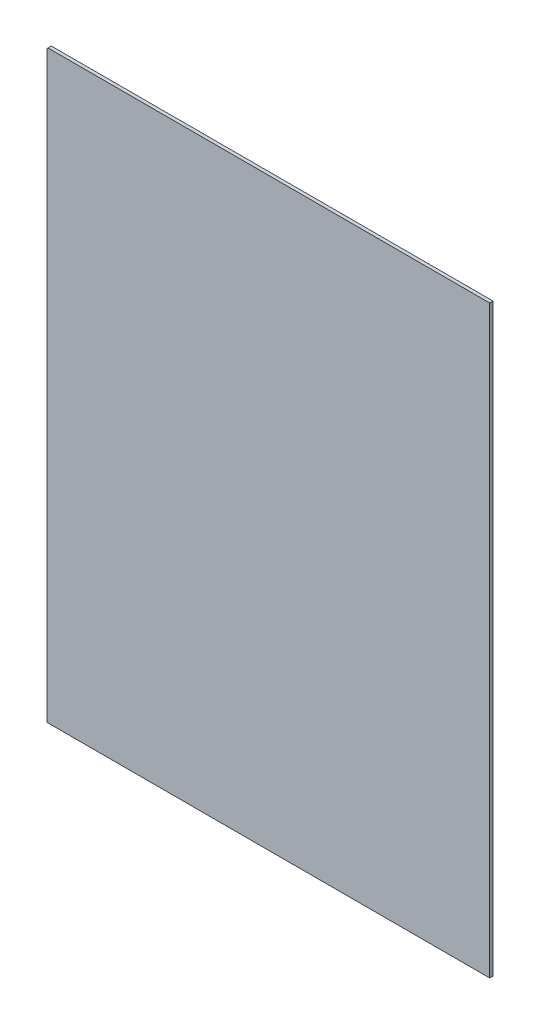
ISO-10303-21;
HEADER;
FILE_DESCRIPTION(('STEP AP214'),'2;1');
FILE_NAME('part.step','',(''),(''),'','','');
FILE_SCHEMA(('AUTOMOTIVE_DESIGN { 1 0 10303 214 1 1 1 1 }'));
ENDSEC;
DATA;
#1=APPLICATION_CONTEXT('core data for automotive mechanical design processes');
#2=APPLICATION_PROTOCOL_DEFINITION('international standard','automotive_design',2000,#1);
#3=PRODUCT_CONTEXT('',#1,'mechanical');
#4=PRODUCT('Part','Part','',(#3));
#5=PRODUCT_RELATED_PRODUCT_CATEGORY('part','',(#4));
#6=PRODUCT_DEFINITION_FORMATION('','',#4);
#7=PRODUCT_DEFINITION_CONTEXT('part definition',#1,'design');
#8=PRODUCT_DEFINITION('design','',#6,#7);
#9=PRODUCT_DEFINITION_SHAPE('','',#8);
#10=(LENGTH_UNIT() NAMED_UNIT(*) SI_UNIT(.MILLI.,.METRE.));
#11=(NAMED_UNIT(*) PLANE_ANGLE_UNIT() SI_UNIT($,.RADIAN.));
#12=(NAMED_UNIT(*) SI_UNIT($,.STERADIAN.) SOLID_ANGLE_UNIT());
#13=UNCERTAINTY_MEASURE_WITH_UNIT(LENGTH_MEASURE(1.E-05),#10,'distance_accuracy_value','');
#14=(GEOMETRIC_REPRESENTATION_CONTEXT(3) GLOBAL_UNCERTAINTY_ASSIGNED_CONTEXT((#13)) GLOBAL_UNIT_ASSIGNED_CONTEXT((#10,
#11,#12)) REPRESENTATION_CONTEXT('',''));
#15=CARTESIAN_POINT('',(0.,0.,0.));
#16=DIRECTION('',(0.,0.,1.));
#17=DIRECTION('',(1.,0.,0.));
#18=AXIS2_PLACEMENT_3D('',#15,#16,#17);
#19=CARTESIAN_POINT('',(0.254000008106,0.,-0.41148));
#20=DIRECTION('',(-1.,0.,0.));
#21=DIRECTION('',(0.,0.,1.));
#22=AXIS2_PLACEMENT_3D('',#19,#20,#21);
#23=PLANE('',#22);
#24=DIRECTION('',(0.,0.,1.));
#25=VECTOR('',#24,1.);
#26=CARTESIAN_POINT('',(0.254000008106,0.,-0.41148));
#27=LINE('',#26,#25);
#28=CARTESIAN_POINT('',(0.254000008106,0.,-0.41148));
#29=VERTEX_POINT('',#28);
#30=CARTESIAN_POINT('',(0.254000008106,0.,0.));
#31=VERTEX_POINT('',#30);
#32=EDGE_CURVE('E10',#29,#31,#27,.T.);
#33=ORIENTED_EDGE('',*,*,#32,.T.);
#34=DIRECTION('',(0.,1.,0.));
#35=VECTOR('',#34,1.);
#36=CARTESIAN_POINT('',(0.254000008106,0.,0.));
#37=LINE('',#36,#35);
#38=CARTESIAN_POINT('',(0.254000008106,71.627998352051,0.));
#39=VERTEX_POINT('',#38);
#40=EDGE_CURVE('E27',#31,#39,#37,.T.);
#41=ORIENTED_EDGE('',*,*,#40,.T.);
#42=DIRECTION('',(0.,0.,1.));
#43=VECTOR('',#42,1.);
#44=CARTESIAN_POINT('',(0.254000008106,71.627998352051,-0.41148));
#45=LINE('',#44,#43);
#46=CARTESIAN_POINT('',(0.254000008106,71.627998352051,-0.41148));
#47=VERTEX_POINT('',#46);
#48=EDGE_CURVE('E116',#47,#39,#45,.T.);
#49=ORIENTED_EDGE('',*,*,#48,.F.);
#50=DIRECTION('',(0.,1.,0.));
#51=VECTOR('',#50,1.);
#52=CARTESIAN_POINT('',(0.254000008106,0.,-0.41148));
#53=LINE('',#52,#51);
#54=EDGE_CURVE('E86',#29,#47,#53,.T.);
#55=ORIENTED_EDGE('',*,*,#54,.F.);
#56=EDGE_LOOP('',(#33,#41,#49,#55));
#57=FACE_BOUND('',#56,.T.);
#58=ADVANCED_FACE('F16',(#57),#23,.T.);
#59=CARTESIAN_POINT('',(0.254000008106,71.627998352051,-0.41148));
#60=DIRECTION('',(-0.707103711415884,0.707109850943884,0.));
#61=DIRECTION('',(0.,0.,1.));
#62=AXIS2_PLACEMENT_3D('',#59,#60,#61);
#63=PLANE('',#62);
#64=ORIENTED_EDGE('',*,*,#48,.T.);
#65=DIRECTION('',(0.707109850943884,0.707103711415884,0.));
#66=VECTOR('',#65,1.);
#67=CARTESIAN_POINT('',(0.254000008106,71.627998352051,0.));
#68=LINE('',#67,#66);
#69=CARTESIAN_POINT('',(0.381000012159,71.754997253418,0.));
#70=VERTEX_POINT('',#69);
#71=EDGE_CURVE('E92',#39,#70,#68,.T.);
#72=ORIENTED_EDGE('',*,*,#71,.T.);
#73=DIRECTION('',(0.,0.,1.));
#74=VECTOR('',#73,1.);
#75=CARTESIAN_POINT('',(0.381000012159,71.754997253418,-0.41148));
#76=LINE('',#75,#74);
#77=CARTESIAN_POINT('',(0.381000012159,71.754997253418,-0.41148));
#78=VERTEX_POINT('',#77);
#79=EDGE_CURVE('E69',#78,#70,#76,.T.);
#80=ORIENTED_EDGE('',*,*,#79,.F.);
#81=DIRECTION('',(0.707109850943884,0.707103711415884,0.));
#82=VECTOR('',#81,1.);
#83=CARTESIAN_POINT('',(0.254000008106,71.627998352051,-0.41148));
#84=LINE('',#83,#82);
#85=EDGE_CURVE('E80',#47,#78,#84,.T.);
#86=ORIENTED_EDGE('',*,*,#85,.F.);
#87=EDGE_LOOP('',(#64,#72,#80,#86));
#88=FACE_BOUND('',#87,.T.);
#89=ADVANCED_FACE('F91',(#88),#63,.T.);
#90=CARTESIAN_POINT('',(0.381000012159,71.754997253418,-0.41148));
#91=DIRECTION('',(0.,1.,0.));
#92=DIRECTION('',(1.,0.,0.));
#93=AXIS2_PLACEMENT_3D('',#90,#91,#92);
#94=PLANE('',#93);
#95=ORIENTED_EDGE('',*,*,#79,.T.);
#96=DIRECTION('',(1.,0.,0.));
#97=VECTOR('',#96,1.);
#98=CARTESIAN_POINT('',(0.381000012159,71.754997253418,0.));
#99=LINE('',#98,#97);
#100=CARTESIAN_POINT('',(54.610000610352,71.754997253418,0.));
#101=VERTEX_POINT('',#100);
#102=EDGE_CURVE('E95',#70,#101,#99,.T.);
#103=ORIENTED_EDGE('',*,*,#102,.T.);
#104=DIRECTION('',(0.,0.,1.));
#105=VECTOR('',#104,1.);
#106=CARTESIAN_POINT('',(54.610000610352,71.754997253418,-0.41148));
#107=LINE('',#106,#105);
#108=CARTESIAN_POINT('',(54.610000610352,71.754997253418,-0.41148));
#109=VERTEX_POINT('',#108);
#110=EDGE_CURVE('E98',#109,#101,#107,.T.);
#111=ORIENTED_EDGE('',*,*,#110,.F.);
#112=DIRECTION('',(1.,0.,0.));
#113=VECTOR('',#112,1.);
#114=CARTESIAN_POINT('',(0.381000012159,71.754997253418,-0.41148));
#115=LINE('',#114,#113);
#116=EDGE_CURVE('E83',#78,#109,#115,.T.);
#117=ORIENTED_EDGE('',*,*,#116,.F.);
#118=EDGE_LOOP('',(#95,#103,#111,#117));
#119=FACE_BOUND('',#118,.T.);
#120=ADVANCED_FACE('F97',(#119),#94,.T.);
#121=CARTESIAN_POINT('',(54.610000610352,71.754997253418,-0.41148));
#122=DIRECTION('',(1.,0.,0.));
#123=DIRECTION('',(0.,1.,0.));
#124=AXIS2_PLACEMENT_3D('',#121,#122,#123);
#125=PLANE('',#124);
#126=ORIENTED_EDGE('',*,*,#110,.T.);
#127=DIRECTION('',(0.,-1.,0.));
#128=VECTOR('',#127,1.);
#129=CARTESIAN_POINT('',(54.610000610352,71.754997253418,0.));
#130=LINE('',#129,#128);
#131=CARTESIAN_POINT('',(54.610000610352,0.,0.));
#132=VERTEX_POINT('',#131);
#133=EDGE_CURVE('E122',#101,#132,#130,.T.);
#134=ORIENTED_EDGE('',*,*,#133,.T.);
#135=DIRECTION('',(0.,0.,1.));
#136=VECTOR('',#135,1.);
#137=CARTESIAN_POINT('',(54.610000610352,0.,-0.41148));
#138=LINE('',#137,#136);
#139=CARTESIAN_POINT('',(54.610000610352,0.,-0.41148));
#140=VERTEX_POINT('',#139);
#141=EDGE_CURVE('E115',#140,#132,#138,.T.);
#142=ORIENTED_EDGE('',*,*,#141,.F.);
#143=DIRECTION('',(0.,-1.,0.));
#144=VECTOR('',#143,1.);
#145=CARTESIAN_POINT('',(54.610000610352,71.754997253418,-0.41148));
#146=LINE('',#145,#144);
#147=EDGE_CURVE('E101',#109,#140,#146,.T.);
#148=ORIENTED_EDGE('',*,*,#147,.F.);
#149=EDGE_LOOP('',(#126,#134,#142,#148));
#150=FACE_BOUND('',#149,.T.);
#151=ADVANCED_FACE('F18',(#150),#125,.T.);
#152=CARTESIAN_POINT('',(54.610000610352,0.,-0.41148));
#153=DIRECTION('',(0.,-1.,0.));
#154=DIRECTION('',(0.,0.,-1.));
#155=AXIS2_PLACEMENT_3D('',#152,#153,#154);
#156=PLANE('',#155);
#157=ORIENTED_EDGE('',*,*,#141,.T.);
#158=DIRECTION('',(-1.,0.,0.));
#159=VECTOR('',#158,1.);
#160=CARTESIAN_POINT('',(54.610000610352,0.,0.));
#161=LINE('',#160,#159);
#162=EDGE_CURVE('E111',#132,#31,#161,.T.);
#163=ORIENTED_EDGE('',*,*,#162,.T.);
#164=ORIENTED_EDGE('',*,*,#32,.F.);
#165=DIRECTION('',(-1.,0.,0.));
#166=VECTOR('',#165,1.);
#167=CARTESIAN_POINT('',(54.610000610352,0.,-0.41148));
#168=LINE('',#167,#166);
#169=EDGE_CURVE('E20',#140,#29,#168,.T.);
#170=ORIENTED_EDGE('',*,*,#169,.F.);
#171=EDGE_LOOP('',(#157,#163,#164,#170));
#172=FACE_BOUND('',#171,.T.);
#173=ADVANCED_FACE('F137',(#172),#156,.T.);
#174=CARTESIAN_POINT('',(0.254000008106,0.,-0.41148));
#175=DIRECTION('',(0.,0.,1.));
#176=DIRECTION('',(1.,0.,0.));
#177=AXIS2_PLACEMENT_3D('',#174,#175,#176);
#178=PLANE('',#177);
#179=ORIENTED_EDGE('',*,*,#54,.T.);
#180=ORIENTED_EDGE('',*,*,#85,.T.);
#181=ORIENTED_EDGE('',*,*,#116,.T.);
#182=ORIENTED_EDGE('',*,*,#147,.T.);
#183=ORIENTED_EDGE('',*,*,#169,.T.);
#184=EDGE_LOOP('',(#179,#180,#181,#182,#183));
#185=FACE_BOUND('',#184,.T.);
#186=ADVANCED_FACE('F81',(#185),#178,.F.);
#187=CARTESIAN_POINT('',(0.254000008106,0.,0.));
#188=DIRECTION('',(0.,0.,1.));
#189=DIRECTION('',(1.,0.,0.));
#190=AXIS2_PLACEMENT_3D('',#187,#188,#189);
#191=PLANE('',#190);
#192=ORIENTED_EDGE('',*,*,#162,.F.);
#193=ORIENTED_EDGE('',*,*,#133,.F.);
#194=ORIENTED_EDGE('',*,*,#102,.F.);
#195=ORIENTED_EDGE('',*,*,#71,.F.);
#196=ORIENTED_EDGE('',*,*,#40,.F.);
#197=EDGE_LOOP('',(#192,#193,#194,#195,#196));
#198=FACE_BOUND('',#197,.T.);
#199=ADVANCED_FACE('F134',(#198),#191,.T.);
#200=CLOSED_SHELL('',(#58,#89,#120,#151,#173,#186,#199));
#201=MANIFOLD_SOLID_BREP('B1',#200);
#202=ADVANCED_BREP_SHAPE_REPRESENTATION('',(#18,#201),#14);
#203=SHAPE_DEFINITION_REPRESENTATION(#9,#202);
ENDSEC;
END-ISO-10303-21;
